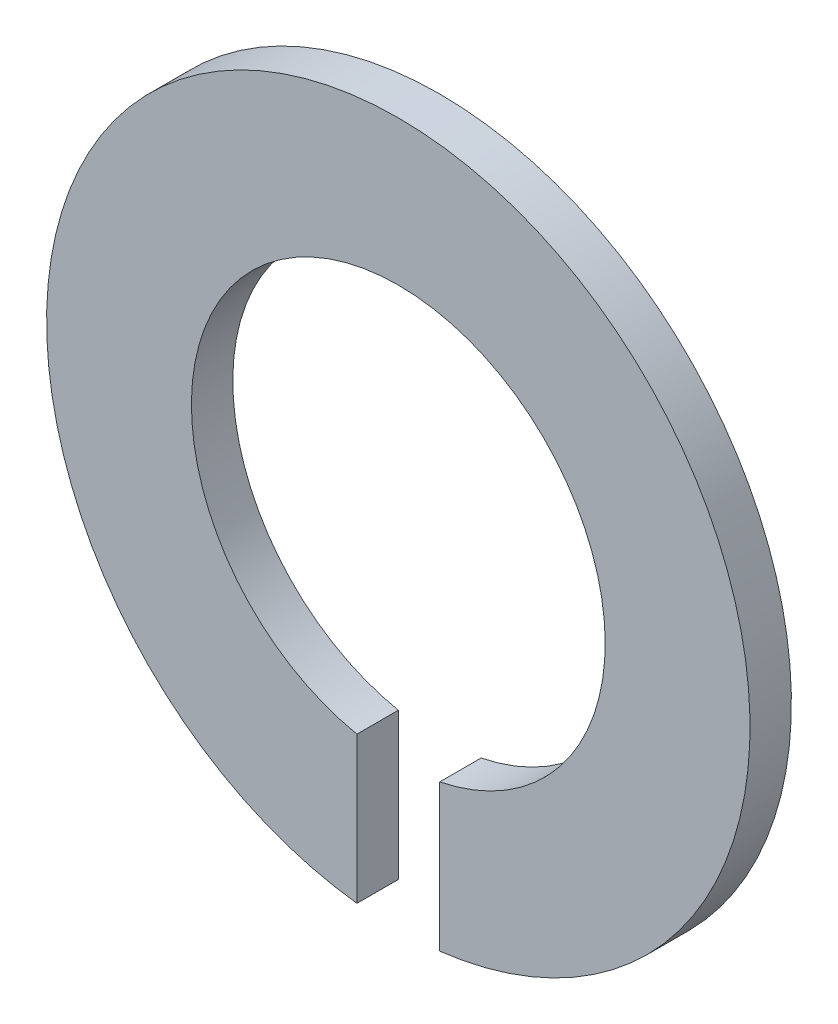
ISO-10303-21;
HEADER;
FILE_DESCRIPTION(('STEP AP214'),'2;1');
FILE_NAME('part.step','',(''),(''),'','','');
FILE_SCHEMA(('AUTOMOTIVE_DESIGN { 1 0 10303 214 1 1 1 1 }'));
ENDSEC;
DATA;
#1=APPLICATION_CONTEXT('core data for automotive mechanical design processes');
#2=APPLICATION_PROTOCOL_DEFINITION('international standard','automotive_design',2000,#1);
#3=PRODUCT_CONTEXT('',#1,'mechanical');
#4=PRODUCT('Part','Part','',(#3));
#5=PRODUCT_RELATED_PRODUCT_CATEGORY('part','',(#4));
#6=PRODUCT_DEFINITION_FORMATION('','',#4);
#7=PRODUCT_DEFINITION_CONTEXT('part definition',#1,'design');
#8=PRODUCT_DEFINITION('design','',#6,#7);
#9=PRODUCT_DEFINITION_SHAPE('','',#8);
#10=(LENGTH_UNIT() NAMED_UNIT(*) SI_UNIT(.MILLI.,.METRE.));
#11=(NAMED_UNIT(*) PLANE_ANGLE_UNIT() SI_UNIT($,.RADIAN.));
#12=(NAMED_UNIT(*) SI_UNIT($,.STERADIAN.) SOLID_ANGLE_UNIT());
#13=UNCERTAINTY_MEASURE_WITH_UNIT(LENGTH_MEASURE(1.E-05),#10,'distance_accuracy_value','');
#14=(GEOMETRIC_REPRESENTATION_CONTEXT(3) GLOBAL_UNCERTAINTY_ASSIGNED_CONTEXT((#13)) GLOBAL_UNIT_ASSIGNED_CONTEXT((#10,
#11,#12)) REPRESENTATION_CONTEXT('',''));
#15=CARTESIAN_POINT('',(0.,0.,0.));
#16=DIRECTION('',(0.,0.,1.));
#17=DIRECTION('',(1.,0.,0.));
#18=AXIS2_PLACEMENT_3D('',#15,#16,#17);
#19=CARTESIAN_POINT('',(0.,0.,0.5));
#20=DIRECTION('',(0.,0.,-1.));
#21=DIRECTION('',(-1.,0.,0.));
#22=AXIS2_PLACEMENT_3D('',#19,#20,#21);
#23=CYLINDRICAL_SURFACE('',#22,4.25);
#24=CARTESIAN_POINT('',(0.,0.,0.));
#25=DIRECTION('',(0.,0.,1.));
#26=DIRECTION('',(1.,0.,0.));
#27=AXIS2_PLACEMENT_3D('',#24,#25,#26);
#28=CIRCLE('',#27,4.25);
#29=CARTESIAN_POINT('',(0.500000000000001,-4.22048575403353,0.));
#30=VERTEX_POINT('',#29);
#31=CARTESIAN_POINT('',(-0.5,-4.22048575403353,0.));
#32=VERTEX_POINT('',#31);
#33=EDGE_CURVE('E113',#30,#32,#28,.T.);
#34=ORIENTED_EDGE('',*,*,#33,.T.);
#35=DIRECTION('',(0.,0.,-1.));
#36=VECTOR('',#35,1.);
#37=CARTESIAN_POINT('',(-0.5,-4.22048575403353,0.5));
#38=LINE('',#37,#36);
#39=CARTESIAN_POINT('',(-0.5,-4.22048575403353,0.5));
#40=VERTEX_POINT('',#39);
#41=EDGE_CURVE('E11',#40,#32,#38,.T.);
#42=ORIENTED_EDGE('',*,*,#41,.F.);
#43=CARTESIAN_POINT('',(0.,0.,0.5));
#44=DIRECTION('',(0.,0.,1.));
#45=DIRECTION('',(1.,0.,0.));
#46=AXIS2_PLACEMENT_3D('',#43,#44,#45);
#47=CIRCLE('',#46,4.25);
#48=CARTESIAN_POINT('',(0.500000000000001,-4.22048575403353,0.5));
#49=VERTEX_POINT('',#48);
#50=EDGE_CURVE('E97',#49,#40,#47,.T.);
#51=ORIENTED_EDGE('',*,*,#50,.F.);
#52=DIRECTION('',(0.,0.,-1.));
#53=VECTOR('',#52,1.);
#54=CARTESIAN_POINT('',(0.500000000000001,-4.22048575403353,0.5));
#55=LINE('',#54,#53);
#56=EDGE_CURVE('E109',#49,#30,#55,.T.);
#57=ORIENTED_EDGE('',*,*,#56,.T.);
#58=EDGE_LOOP('',(#34,#42,#51,#57));
#59=FACE_BOUND('',#58,.T.);
#60=ADVANCED_FACE('F45',(#59),#23,.T.);
#61=CARTESIAN_POINT('',(-0.5,-4.22048575403353,0.5));
#62=DIRECTION('',(-1.,0.,0.));
#63=DIRECTION('',(0.,-1.,0.));
#64=AXIS2_PLACEMENT_3D('',#61,#62,#63);
#65=PLANE('',#64);
#66=DIRECTION('',(0.,1.,0.));
#67=VECTOR('',#66,1.);
#68=CARTESIAN_POINT('',(-0.5,-4.22048575403353,0.));
#69=LINE('',#68,#67);
#70=CARTESIAN_POINT('',(-0.500000000000001,-2.44948974278318,0.));
#71=VERTEX_POINT('',#70);
#72=EDGE_CURVE('E102',#32,#71,#69,.T.);
#73=ORIENTED_EDGE('',*,*,#72,.T.);
#74=DIRECTION('',(0.,0.,-1.));
#75=VECTOR('',#74,1.);
#76=CARTESIAN_POINT('',(-0.500000000000001,-2.44948974278318,0.5));
#77=LINE('',#76,#75);
#78=CARTESIAN_POINT('',(-0.500000000000001,-2.44948974278318,0.5));
#79=VERTEX_POINT('',#78);
#80=EDGE_CURVE('E54',#79,#71,#77,.T.);
#81=ORIENTED_EDGE('',*,*,#80,.F.);
#82=DIRECTION('',(0.,1.,0.));
#83=VECTOR('',#82,1.);
#84=CARTESIAN_POINT('',(-0.5,-4.22048575403353,0.5));
#85=LINE('',#84,#83);
#86=EDGE_CURVE('E92',#40,#79,#85,.T.);
#87=ORIENTED_EDGE('',*,*,#86,.F.);
#88=ORIENTED_EDGE('',*,*,#41,.T.);
#89=EDGE_LOOP('',(#73,#81,#87,#88));
#90=FACE_BOUND('',#89,.T.);
#91=ADVANCED_FACE('F101',(#90),#65,.F.);
#92=CARTESIAN_POINT('',(0.,0.,0.5));
#93=DIRECTION('',(0.,0.,-1.));
#94=DIRECTION('',(-1.,0.,0.));
#95=AXIS2_PLACEMENT_3D('',#92,#93,#94);
#96=CYLINDRICAL_SURFACE('',#95,2.5);
#97=CARTESIAN_POINT('',(0.,0.,0.));
#98=DIRECTION('',(0.,0.,-1.));
#99=DIRECTION('',(1.,0.,0.));
#100=AXIS2_PLACEMENT_3D('',#97,#98,#99);
#101=CIRCLE('',#100,2.5);
#102=CARTESIAN_POINT('',(0.5,-2.44948974278318,0.));
#103=VERTEX_POINT('',#102);
#104=EDGE_CURVE('E79',#71,#103,#101,.T.);
#105=ORIENTED_EDGE('',*,*,#104,.T.);
#106=DIRECTION('',(0.,0.,-1.));
#107=VECTOR('',#106,1.);
#108=CARTESIAN_POINT('',(0.5,-2.44948974278318,0.5));
#109=LINE('',#108,#107);
#110=CARTESIAN_POINT('',(0.5,-2.44948974278318,0.5));
#111=VERTEX_POINT('',#110);
#112=EDGE_CURVE('E104',#111,#103,#109,.T.);
#113=ORIENTED_EDGE('',*,*,#112,.F.);
#114=CARTESIAN_POINT('',(0.,0.,0.5));
#115=DIRECTION('',(0.,0.,-1.));
#116=DIRECTION('',(1.,0.,0.));
#117=AXIS2_PLACEMENT_3D('',#114,#115,#116);
#118=CIRCLE('',#117,2.5);
#119=EDGE_CURVE('E95',#79,#111,#118,.T.);
#120=ORIENTED_EDGE('',*,*,#119,.F.);
#121=ORIENTED_EDGE('',*,*,#80,.T.);
#122=EDGE_LOOP('',(#105,#113,#120,#121));
#123=FACE_BOUND('',#122,.T.);
#124=ADVANCED_FACE('F105',(#123),#96,.F.);
#125=CARTESIAN_POINT('',(0.500000000000001,-4.22048575403353,0.5));
#126=DIRECTION('',(1.,0.,0.));
#127=DIRECTION('',(0.,1.,0.));
#128=AXIS2_PLACEMENT_3D('',#125,#126,#127);
#129=PLANE('',#128);
#130=DIRECTION('',(0.,-1.,0.));
#131=VECTOR('',#130,1.);
#132=CARTESIAN_POINT('',(0.500000000000001,-4.22048575403353,0.));
#133=LINE('',#132,#131);
#134=EDGE_CURVE('E85',#103,#30,#133,.T.);
#135=ORIENTED_EDGE('',*,*,#134,.T.);
#136=ORIENTED_EDGE('',*,*,#56,.F.);
#137=DIRECTION('',(0.,-1.,0.));
#138=VECTOR('',#137,1.);
#139=CARTESIAN_POINT('',(0.500000000000001,-4.22048575403353,0.5));
#140=LINE('',#139,#138);
#141=EDGE_CURVE('E62',#111,#49,#140,.T.);
#142=ORIENTED_EDGE('',*,*,#141,.F.);
#143=ORIENTED_EDGE('',*,*,#112,.T.);
#144=EDGE_LOOP('',(#135,#136,#142,#143));
#145=FACE_BOUND('',#144,.T.);
#146=ADVANCED_FACE('F126',(#145),#129,.F.);
#147=CARTESIAN_POINT('',(0.,0.,0.5));
#148=DIRECTION('',(0.,0.,1.));
#149=DIRECTION('',(1.,0.,0.));
#150=AXIS2_PLACEMENT_3D('',#147,#148,#149);
#151=PLANE('',#150);
#152=ORIENTED_EDGE('',*,*,#50,.T.);
#153=ORIENTED_EDGE('',*,*,#86,.T.);
#154=ORIENTED_EDGE('',*,*,#119,.T.);
#155=ORIENTED_EDGE('',*,*,#141,.T.);
#156=EDGE_LOOP('',(#152,#153,#154,#155));
#157=FACE_BOUND('',#156,.T.);
#158=ADVANCED_FACE('F93',(#157),#151,.T.);
#159=CARTESIAN_POINT('',(0.,0.,0.));
#160=DIRECTION('',(0.,0.,1.));
#161=DIRECTION('',(1.,0.,0.));
#162=AXIS2_PLACEMENT_3D('',#159,#160,#161);
#163=PLANE('',#162);
#164=ORIENTED_EDGE('',*,*,#33,.F.);
#165=ORIENTED_EDGE('',*,*,#134,.F.);
#166=ORIENTED_EDGE('',*,*,#104,.F.);
#167=ORIENTED_EDGE('',*,*,#72,.F.);
#168=EDGE_LOOP('',(#164,#165,#166,#167));
#169=FACE_BOUND('',#168,.T.);
#170=ADVANCED_FACE('F129',(#169),#163,.F.);
#171=CLOSED_SHELL('',(#60,#91,#124,#146,#158,#170));
#172=MANIFOLD_SOLID_BREP('B2',#171);
#173=ADVANCED_BREP_SHAPE_REPRESENTATION('',(#18,#172),#14);
#174=SHAPE_DEFINITION_REPRESENTATION(#9,#173);
ENDSEC;
END-ISO-10303-21;
